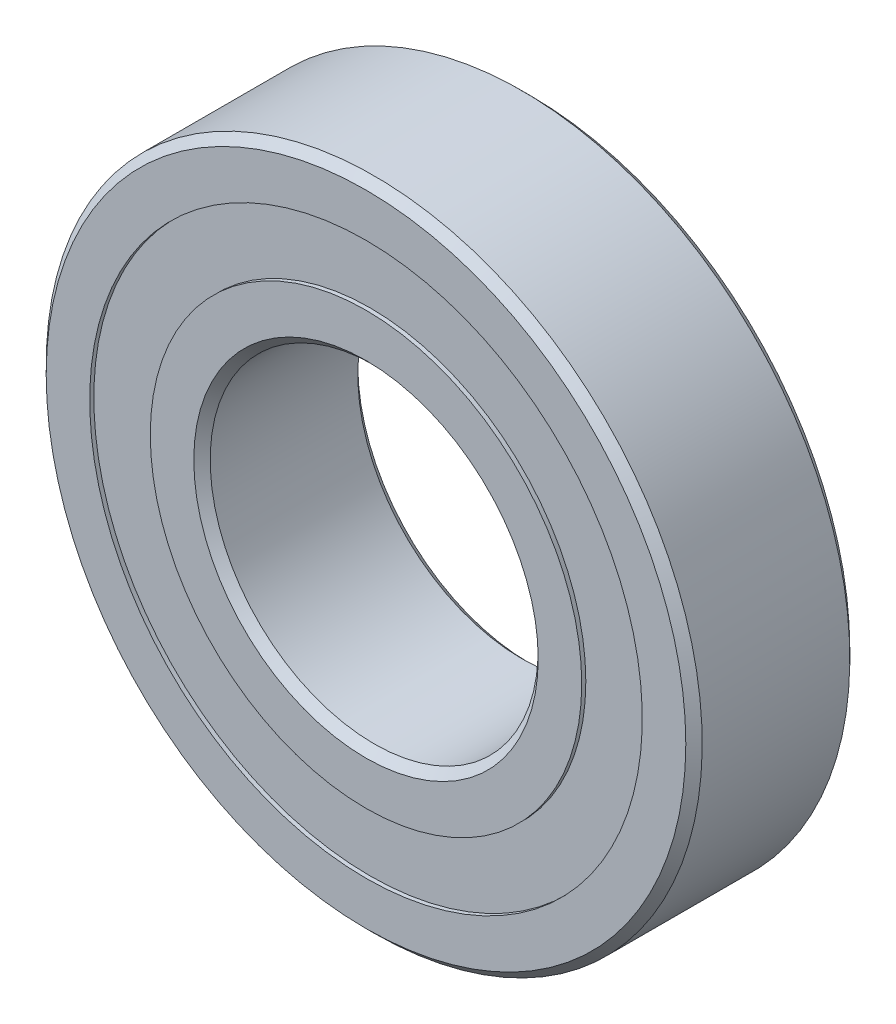
ISO-10303-21;
HEADER;
FILE_DESCRIPTION(('STEP AP214'),'2;1');
FILE_NAME('part.step','',(''),(''),'','','');
FILE_SCHEMA(('AUTOMOTIVE_DESIGN { 1 0 10303 214 1 1 1 1 }'));
ENDSEC;
DATA;
#1=APPLICATION_CONTEXT('core data for automotive mechanical design processes');
#2=APPLICATION_PROTOCOL_DEFINITION('international standard','automotive_design',2000,#1);
#3=PRODUCT_CONTEXT('',#1,'mechanical');
#4=PRODUCT('Part','Part','',(#3));
#5=PRODUCT_RELATED_PRODUCT_CATEGORY('part','',(#4));
#6=PRODUCT_DEFINITION_FORMATION('','',#4);
#7=PRODUCT_DEFINITION_CONTEXT('part definition',#1,'design');
#8=PRODUCT_DEFINITION('design','',#6,#7);
#9=PRODUCT_DEFINITION_SHAPE('','',#8);
#10=(LENGTH_UNIT() NAMED_UNIT(*) SI_UNIT(.MILLI.,.METRE.));
#11=(NAMED_UNIT(*) PLANE_ANGLE_UNIT() SI_UNIT($,.RADIAN.));
#12=(NAMED_UNIT(*) SI_UNIT($,.STERADIAN.) SOLID_ANGLE_UNIT());
#13=UNCERTAINTY_MEASURE_WITH_UNIT(LENGTH_MEASURE(1.E-05),#10,'distance_accuracy_value','');
#14=(GEOMETRIC_REPRESENTATION_CONTEXT(3) GLOBAL_UNCERTAINTY_ASSIGNED_CONTEXT((#13)) GLOBAL_UNIT_ASSIGNED_CONTEXT((#10,
#11,#12)) REPRESENTATION_CONTEXT('',''));
#15=CARTESIAN_POINT('',(0.,0.,0.));
#16=DIRECTION('',(0.,0.,1.));
#17=DIRECTION('',(1.,0.,0.));
#18=AXIS2_PLACEMENT_3D('',#15,#16,#17);
#19=CARTESIAN_POINT('',(0.,21.3946153846154,-6.0325));
#20=DIRECTION('',(0.,0.,1.));
#21=DIRECTION('',(0.,-1.,0.));
#22=AXIS2_PLACEMENT_3D('',#19,#20,#21);
#23=PLANE('',#22);
#24=CARTESIAN_POINT('',(0.,0.,-6.03250000000001));
#25=DIRECTION('',(0.,0.,1.));
#26=DIRECTION('',(0.,-1.,0.));
#27=AXIS2_PLACEMENT_3D('',#24,#25,#26);
#28=CIRCLE('',#27,21.3946153846154);
#29=CARTESIAN_POINT('',(0.,-21.3946153846154,-6.03250000000001));
#30=VERTEX_POINT('',#29);
#31=EDGE_CURVE('E68',#30,#30,#28,.T.);
#32=ORIENTED_EDGE('',*,*,#31,.F.);
#33=EDGE_LOOP('',(#32));
#34=FACE_BOUND('',#33,.T.);
#35=CARTESIAN_POINT('',(0.,0.,-6.03250000000001));
#36=DIRECTION('',(0.,0.,1.));
#37=DIRECTION('',(0.,-1.,0.));
#38=AXIS2_PLACEMENT_3D('',#35,#36,#37);
#39=CIRCLE('',#38,16.7053846153846);
#40=CARTESIAN_POINT('',(0.,-16.7053846153846,-6.03250000000001));
#41=VERTEX_POINT('',#40);
#42=EDGE_CURVE('E11',#41,#41,#39,.T.);
#43=ORIENTED_EDGE('',*,*,#42,.T.);
#44=EDGE_LOOP('',(#43));
#45=FACE_BOUND('',#44,.T.);
#46=ADVANCED_FACE('F50',(#34,#45),#23,.F.);
#47=CARTESIAN_POINT('',(0.,0.,6.35));
#48=DIRECTION('',(0.,0.,1.));
#49=DIRECTION('',(0.,-1.,0.));
#50=AXIS2_PLACEMENT_3D('',#47,#48,#49);
#51=CYLINDRICAL_SURFACE('',#50,16.7053846153846);
#52=ORIENTED_EDGE('',*,*,#42,.F.);
#53=EDGE_LOOP('',(#52));
#54=FACE_BOUND('',#53,.T.);
#55=CARTESIAN_POINT('',(0.,0.,-3.6690815708267));
#56=DIRECTION('',(0.,0.,1.));
#57=DIRECTION('',(0.,-1.,0.));
#58=AXIS2_PLACEMENT_3D('',#55,#56,#57);
#59=CIRCLE('',#58,16.7053846153846);
#60=CARTESIAN_POINT('',(0.,-16.7053846153846,-3.6690815708267));
#61=VERTEX_POINT('',#60);
#62=EDGE_CURVE('E57',#61,#61,#59,.T.);
#63=ORIENTED_EDGE('',*,*,#62,.T.);
#64=EDGE_LOOP('',(#63));
#65=FACE_BOUND('',#64,.T.);
#66=ADVANCED_FACE('F77',(#54,#65),#51,.F.);
#67=CARTESIAN_POINT('',(0.,21.3946153846154,-3.66908157082669));
#68=DIRECTION('',(0.,0.,-1.));
#69=DIRECTION('',(0.,1.,0.));
#70=AXIS2_PLACEMENT_3D('',#67,#68,#69);
#71=PLANE('',#70);
#72=ORIENTED_EDGE('',*,*,#62,.F.);
#73=EDGE_LOOP('',(#72));
#74=FACE_BOUND('',#73,.T.);
#75=CARTESIAN_POINT('',(0.,0.,-3.6690815708267));
#76=DIRECTION('',(0.,0.,1.));
#77=DIRECTION('',(0.,-1.,0.));
#78=AXIS2_PLACEMENT_3D('',#75,#76,#77);
#79=CIRCLE('',#78,21.3946153846154);
#80=CARTESIAN_POINT('',(0.,-21.3946153846154,-3.6690815708267));
#81=VERTEX_POINT('',#80);
#82=EDGE_CURVE('E63',#81,#81,#79,.T.);
#83=ORIENTED_EDGE('',*,*,#82,.T.);
#84=EDGE_LOOP('',(#83));
#85=FACE_BOUND('',#84,.T.);
#86=ADVANCED_FACE('F81',(#74,#85),#71,.F.);
#87=CARTESIAN_POINT('',(0.,0.,6.35));
#88=DIRECTION('',(0.,0.,1.));
#89=DIRECTION('',(0.,-1.,0.));
#90=AXIS2_PLACEMENT_3D('',#87,#88,#89);
#91=CYLINDRICAL_SURFACE('',#90,21.3946153846154);
#92=ORIENTED_EDGE('',*,*,#82,.F.);
#93=EDGE_LOOP('',(#92));
#94=FACE_BOUND('',#93,.T.);
#95=ORIENTED_EDGE('',*,*,#31,.T.);
#96=EDGE_LOOP('',(#95));
#97=FACE_BOUND('',#96,.T.);
#98=ADVANCED_FACE('F74',(#94,#97),#91,.T.);
#99=CLOSED_SHELL('',(#46,#66,#86,#98));
#100=MANIFOLD_SOLID_BREP('B2',#99);
#101=CARTESIAN_POINT('',(0.,21.3946153846154,6.0325));
#102=DIRECTION('',(0.,0.,-1.));
#103=DIRECTION('',(0.,1.,0.));
#104=AXIS2_PLACEMENT_3D('',#101,#102,#103);
#105=PLANE('',#104);
#106=CARTESIAN_POINT('',(0.,0.,6.0325));
#107=DIRECTION('',(0.,0.,1.));
#108=DIRECTION('',(0.,-1.,0.));
#109=AXIS2_PLACEMENT_3D('',#106,#107,#108);
#110=CIRCLE('',#109,16.7053846153846);
#111=CARTESIAN_POINT('',(0.,-16.7053846153846,6.03249999999999));
#112=VERTEX_POINT('',#111);
#113=EDGE_CURVE('E49',#112,#112,#110,.T.);
#114=ORIENTED_EDGE('',*,*,#113,.F.);
#115=EDGE_LOOP('',(#114));
#116=FACE_BOUND('',#115,.T.);
#117=CARTESIAN_POINT('',(0.,0.,6.0325));
#118=DIRECTION('',(0.,0.,1.));
#119=DIRECTION('',(0.,-1.,0.));
#120=AXIS2_PLACEMENT_3D('',#117,#118,#119);
#121=CIRCLE('',#120,21.3946153846154);
#122=CARTESIAN_POINT('',(0.,-21.3946153846154,6.03249999999999));
#123=VERTEX_POINT('',#122);
#124=EDGE_CURVE('E136',#123,#123,#121,.T.);
#125=ORIENTED_EDGE('',*,*,#124,.T.);
#126=EDGE_LOOP('',(#125));
#127=FACE_BOUND('',#126,.T.);
#128=ADVANCED_FACE('F118',(#116,#127),#105,.F.);
#129=CARTESIAN_POINT('',(0.,0.,6.35));
#130=DIRECTION('',(0.,0.,1.));
#131=DIRECTION('',(0.,-1.,0.));
#132=AXIS2_PLACEMENT_3D('',#129,#130,#131);
#133=CYLINDRICAL_SURFACE('',#132,16.7053846153846);
#134=CARTESIAN_POINT('',(0.,0.,3.66908157082669));
#135=DIRECTION('',(0.,0.,1.));
#136=DIRECTION('',(0.,-1.,0.));
#137=AXIS2_PLACEMENT_3D('',#134,#135,#136);
#138=CIRCLE('',#137,16.7053846153846);
#139=CARTESIAN_POINT('',(0.,-16.7053846153846,3.66908157082669));
#140=VERTEX_POINT('',#139);
#141=EDGE_CURVE('E125',#140,#140,#138,.T.);
#142=ORIENTED_EDGE('',*,*,#141,.F.);
#143=EDGE_LOOP('',(#142));
#144=FACE_BOUND('',#143,.T.);
#145=ORIENTED_EDGE('',*,*,#113,.T.);
#146=EDGE_LOOP('',(#145));
#147=FACE_BOUND('',#146,.T.);
#148=ADVANCED_FACE('F151',(#144,#147),#133,.F.);
#149=CARTESIAN_POINT('',(0.,21.3946153846154,3.66908157082669));
#150=DIRECTION('',(0.,0.,1.));
#151=DIRECTION('',(0.,-1.,0.));
#152=AXIS2_PLACEMENT_3D('',#149,#150,#151);
#153=PLANE('',#152);
#154=CARTESIAN_POINT('',(0.,0.,3.66908157082669));
#155=DIRECTION('',(0.,0.,1.));
#156=DIRECTION('',(0.,-1.,0.));
#157=AXIS2_PLACEMENT_3D('',#154,#155,#156);
#158=CIRCLE('',#157,21.3946153846154);
#159=CARTESIAN_POINT('',(0.,-21.3946153846154,3.66908157082669));
#160=VERTEX_POINT('',#159);
#161=EDGE_CURVE('E131',#160,#160,#158,.T.);
#162=ORIENTED_EDGE('',*,*,#161,.F.);
#163=EDGE_LOOP('',(#162));
#164=FACE_BOUND('',#163,.T.);
#165=ORIENTED_EDGE('',*,*,#141,.T.);
#166=EDGE_LOOP('',(#165));
#167=FACE_BOUND('',#166,.T.);
#168=ADVANCED_FACE('F146',(#164,#167),#153,.F.);
#169=CARTESIAN_POINT('',(0.,0.,6.35));
#170=DIRECTION('',(0.,0.,1.));
#171=DIRECTION('',(0.,-1.,0.));
#172=AXIS2_PLACEMENT_3D('',#169,#170,#171);
#173=CYLINDRICAL_SURFACE('',#172,21.3946153846154);
#174=ORIENTED_EDGE('',*,*,#124,.F.);
#175=EDGE_LOOP('',(#174));
#176=FACE_BOUND('',#175,.T.);
#177=ORIENTED_EDGE('',*,*,#161,.T.);
#178=EDGE_LOOP('',(#177));
#179=FACE_BOUND('',#178,.T.);
#180=ADVANCED_FACE('F143',(#176,#179),#173,.T.);
#181=CLOSED_SHELL('',(#128,#148,#168,#180));
#182=MANIFOLD_SOLID_BREP('B6',#181);
#183=CARTESIAN_POINT('',(-9.52499999999979,16.4977839420937,0.));
#184=DIRECTION('',(0.,0.,1.));
#185=DIRECTION('',(-0.499999999999989,0.866025403784445,0.));
#186=AXIS2_PLACEMENT_3D('',#183,#184,#185);
#187=SPHERICAL_SURFACE('',#186,3.66908157082669);
#188=CARTESIAN_POINT('',(-9.52499999999979,16.4977839420937,3.66908157082669));
#189=VERTEX_POINT('',#188);
#190=VERTEX_LOOP('',#189);
#191=FACE_BOUND('',#190,.T.);
#192=ADVANCED_FACE('F203',(#191),#187,.T.);
#193=CLOSED_SHELL('',(#192));
#194=MANIFOLD_SOLID_BREP('B44',#193);
#195=CARTESIAN_POINT('',(-16.4977839420934,9.52500000000019,0.));
#196=DIRECTION('',(0.,0.,1.));
#197=DIRECTION('',(-0.866025403784433,0.50000000000001,0.));
#198=AXIS2_PLACEMENT_3D('',#195,#196,#197);
#199=SPHERICAL_SURFACE('',#198,3.66908157082669);
#200=CARTESIAN_POINT('',(-16.4977839420934,9.52500000000019,3.66908157082669));
#201=VERTEX_POINT('',#200);
#202=VERTEX_LOOP('',#201);
#203=FACE_BOUND('',#202,.T.);
#204=ADVANCED_FACE('F220',(#203),#199,.T.);
#205=CLOSED_SHELL('',(#204));
#206=MANIFOLD_SOLID_BREP('B114',#205);
#207=CARTESIAN_POINT('',(-19.05,1.99538158514885E-13,0.));
#208=DIRECTION('',(0.,0.,1.));
#209=DIRECTION('',(-1.,0.,0.));
#210=AXIS2_PLACEMENT_3D('',#207,#208,#209);
#211=SPHERICAL_SURFACE('',#210,3.66908157082669);
#212=CARTESIAN_POINT('',(-19.05,1.98864159164657E-13,3.66908157082669));
#213=VERTEX_POINT('',#212);
#214=VERTEX_LOOP('',#213);
#215=FACE_BOUND('',#214,.T.);
#216=ADVANCED_FACE('F237',(#215),#211,.T.);
#217=CLOSED_SHELL('',(#216));
#218=MANIFOLD_SOLID_BREP('B199',#217);
#219=CARTESIAN_POINT('',(-16.4977839420936,-9.52499999999985,0.));
#220=DIRECTION('',(0.,0.,1.));
#221=DIRECTION('',(-0.866025403784443,-0.499999999999992,0.));
#222=AXIS2_PLACEMENT_3D('',#219,#220,#221);
#223=SPHERICAL_SURFACE('',#222,3.66908157082669);
#224=CARTESIAN_POINT('',(-16.4977839420936,-9.52499999999985,3.66908157082669));
#225=VERTEX_POINT('',#224);
#226=VERTEX_LOOP('',#225);
#227=FACE_BOUND('',#226,.T.);
#228=ADVANCED_FACE('F254',(#227),#223,.T.);
#229=CLOSED_SHELL('',(#228));
#230=MANIFOLD_SOLID_BREP('B216',#229);
#231=CARTESIAN_POINT('',(-9.52500000000013,-16.4977839420935,0.));
#232=DIRECTION('',(0.,0.,1.));
#233=DIRECTION('',(-0.500000000000007,-0.866025403784435,0.));
#234=AXIS2_PLACEMENT_3D('',#231,#232,#233);
#235=SPHERICAL_SURFACE('',#234,3.66908157082669);
#236=CARTESIAN_POINT('',(-9.52500000000013,-16.4977839420935,3.66908157082669));
#237=VERTEX_POINT('',#236);
#238=VERTEX_LOOP('',#237);
#239=FACE_BOUND('',#238,.T.);
#240=ADVANCED_FACE('F271',(#239),#235,.T.);
#241=CLOSED_SHELL('',(#240));
#242=MANIFOLD_SOLID_BREP('B233',#241);
#243=CARTESIAN_POINT('',(0.,-19.05,0.));
#244=DIRECTION('',(0.,0.,1.));
#245=DIRECTION('',(0.,-1.,0.));
#246=AXIS2_PLACEMENT_3D('',#243,#244,#245);
#247=SPHERICAL_SURFACE('',#246,3.66908157082669);
#248=CARTESIAN_POINT('',(0.,-19.05,3.66908157082669));
#249=VERTEX_POINT('',#248);
#250=VERTEX_LOOP('',#249);
#251=FACE_BOUND('',#250,.T.);
#252=ADVANCED_FACE('F288',(#251),#247,.T.);
#253=CLOSED_SHELL('',(#252));
#254=MANIFOLD_SOLID_BREP('B250',#253);
#255=CARTESIAN_POINT('',(9.5249999999999,-16.4977839420936,0.));
#256=DIRECTION('',(0.,0.,1.));
#257=DIRECTION('',(0.499999999999995,-0.866025403784442,0.));
#258=AXIS2_PLACEMENT_3D('',#255,#256,#257);
#259=SPHERICAL_SURFACE('',#258,3.66908157082669);
#260=CARTESIAN_POINT('',(9.5249999999999,-16.4977839420936,3.66908157082669));
#261=VERTEX_POINT('',#260);
#262=VERTEX_LOOP('',#261);
#263=FACE_BOUND('',#262,.T.);
#264=ADVANCED_FACE('F305',(#263),#259,.T.);
#265=CLOSED_SHELL('',(#264));
#266=MANIFOLD_SOLID_BREP('B267',#265);
#267=CARTESIAN_POINT('',(16.4977839420935,-9.52500000000008,0.));
#268=DIRECTION('',(0.,0.,1.));
#269=DIRECTION('',(0.866025403784436,-0.500000000000004,0.));
#270=AXIS2_PLACEMENT_3D('',#267,#268,#269);
#271=SPHERICAL_SURFACE('',#270,3.66908157082669);
#272=CARTESIAN_POINT('',(16.4977839420935,-9.52500000000008,3.66908157082669));
#273=VERTEX_POINT('',#272);
#274=VERTEX_LOOP('',#273);
#275=FACE_BOUND('',#274,.T.);
#276=ADVANCED_FACE('F322',(#275),#271,.T.);
#277=CLOSED_SHELL('',(#276));
#278=MANIFOLD_SOLID_BREP('B284',#277);
#279=CARTESIAN_POINT('',(19.05,0.,0.));
#280=DIRECTION('',(0.,0.,1.));
#281=DIRECTION('',(1.,0.,0.));
#282=AXIS2_PLACEMENT_3D('',#279,#280,#281);
#283=SPHERICAL_SURFACE('',#282,3.66908157082669);
#284=CARTESIAN_POINT('',(19.05,0.,3.66908157082669));
#285=VERTEX_POINT('',#284);
#286=VERTEX_LOOP('',#285);
#287=FACE_BOUND('',#286,.T.);
#288=ADVANCED_FACE('F339',(#287),#283,.T.);
#289=CLOSED_SHELL('',(#288));
#290=MANIFOLD_SOLID_BREP('B301',#289);
#291=CARTESIAN_POINT('',(16.4977839420936,9.52499999999996,0.));
#292=DIRECTION('',(0.,0.,1.));
#293=DIRECTION('',(0.86602540378444,0.499999999999998,0.));
#294=AXIS2_PLACEMENT_3D('',#291,#292,#293);
#295=SPHERICAL_SURFACE('',#294,3.66908157082669);
#296=CARTESIAN_POINT('',(16.4977839420936,9.52499999999996,3.66908157082669));
#297=VERTEX_POINT('',#296);
#298=VERTEX_LOOP('',#297);
#299=FACE_BOUND('',#298,.T.);
#300=ADVANCED_FACE('F357',(#299),#295,.T.);
#301=CLOSED_SHELL('',(#300));
#302=MANIFOLD_SOLID_BREP('B318',#301);
#303=CARTESIAN_POINT('',(9.52500000000002,16.4977839420935,0.));
#304=DIRECTION('',(0.,0.,1.));
#305=DIRECTION('',(0.500000000000001,0.866025403784438,0.));
#306=AXIS2_PLACEMENT_3D('',#303,#304,#305);
#307=SPHERICAL_SURFACE('',#306,3.66908157082669);
#308=CARTESIAN_POINT('',(9.52500000000002,16.4977839420935,3.66908157082669));
#309=VERTEX_POINT('',#308);
#310=VERTEX_LOOP('',#309);
#311=FACE_BOUND('',#310,.T.);
#312=ADVANCED_FACE('F374',(#311),#307,.T.);
#313=CLOSED_SHELL('',(#312));
#314=MANIFOLD_SOLID_BREP('B335',#313);
#315=CARTESIAN_POINT('',(0.,19.05,0.));
#316=DIRECTION('',(0.,0.,1.));
#317=DIRECTION('',(0.,1.,0.));
#318=AXIS2_PLACEMENT_3D('',#315,#316,#317);
#319=SPHERICAL_SURFACE('',#318,3.66908157082669);
#320=CARTESIAN_POINT('',(0.,19.05,3.66908157082669));
#321=VERTEX_POINT('',#320);
#322=VERTEX_LOOP('',#321);
#323=FACE_BOUND('',#322,.T.);
#324=ADVANCED_FACE('F393',(#323),#319,.T.);
#325=CLOSED_SHELL('',(#324));
#326=MANIFOLD_SOLID_BREP('B353',#325);
#327=CARTESIAN_POINT('',(0.,13.335,6.35000000000001));
#328=DIRECTION('',(0.,0.,-1.));
#329=DIRECTION('',(0.,1.,0.));
#330=AXIS2_PLACEMENT_3D('',#327,#328,#329);
#331=PLANE('',#330);
#332=CARTESIAN_POINT('',(0.,0.,6.35000000000001));
#333=DIRECTION('',(0.,0.,1.));
#334=DIRECTION('',(0.,-1.,0.));
#335=AXIS2_PLACEMENT_3D('',#332,#333,#334);
#336=CIRCLE('',#335,13.335);
#337=CARTESIAN_POINT('',(0.,-13.335,6.35));
#338=VERTEX_POINT('',#337);
#339=EDGE_CURVE('E446',#338,#338,#336,.T.);
#340=ORIENTED_EDGE('',*,*,#339,.F.);
#341=EDGE_LOOP('',(#340));
#342=FACE_BOUND('',#341,.T.);
#343=CARTESIAN_POINT('',(0.,0.,6.35000000000001));
#344=DIRECTION('',(0.,0.,1.));
#345=DIRECTION('',(0.,-1.,0.));
#346=AXIS2_PLACEMENT_3D('',#343,#344,#345);
#347=CIRCLE('',#346,16.7053846153846);
#348=CARTESIAN_POINT('',(0.,-16.7053846153846,6.35));
#349=VERTEX_POINT('',#348);
#350=EDGE_CURVE('E392',#349,#349,#347,.T.);
#351=ORIENTED_EDGE('',*,*,#350,.T.);
#352=EDGE_LOOP('',(#351));
#353=FACE_BOUND('',#352,.T.);
#354=ADVANCED_FACE('F411',(#342,#353),#331,.F.);
#355=CARTESIAN_POINT('',(0.,0.,6.35));
#356=DIRECTION('',(0.,0.,1.));
#357=DIRECTION('',(0.,-1.,0.));
#358=AXIS2_PLACEMENT_3D('',#355,#356,#357);
#359=CYLINDRICAL_SURFACE('',#358,16.7053846153846);
#360=ORIENTED_EDGE('',*,*,#350,.F.);
#361=EDGE_LOOP('',(#360));
#362=FACE_BOUND('',#361,.T.);
#363=CARTESIAN_POINT('',(0.,0.,2.82222222222221));
#364=DIRECTION('',(0.,0.,1.));
#365=DIRECTION('',(0.,-1.,0.));
#366=AXIS2_PLACEMENT_3D('',#363,#364,#365);
#367=CIRCLE('',#366,16.7053846153846);
#368=CARTESIAN_POINT('',(0.,-16.7053846153846,2.82222222222221));
#369=VERTEX_POINT('',#368);
#370=EDGE_CURVE('E418',#369,#369,#367,.T.);
#371=ORIENTED_EDGE('',*,*,#370,.T.);
#372=EDGE_LOOP('',(#371));
#373=FACE_BOUND('',#372,.T.);
#374=ADVANCED_FACE('F454',(#362,#373),#359,.T.);
#375=CARTESIAN_POINT('',(0.,0.,0.));
#376=DIRECTION('',(0.,0.,1.));
#377=DIRECTION('',(0.,-1.,0.));
#378=AXIS2_PLACEMENT_3D('',#375,#376,#377);
#379=TOROIDAL_SURFACE('',#378,19.05,3.66908157082669);
#380=ORIENTED_EDGE('',*,*,#370,.F.);
#381=EDGE_LOOP('',(#380));
#382=FACE_BOUND('',#381,.T.);
#383=CARTESIAN_POINT('',(0.,0.,-2.82222222222222));
#384=DIRECTION('',(0.,0.,1.));
#385=DIRECTION('',(0.,-1.,0.));
#386=AXIS2_PLACEMENT_3D('',#383,#384,#385);
#387=CIRCLE('',#386,16.7053846153846);
#388=CARTESIAN_POINT('',(0.,-16.7053846153846,-2.82222222222222));
#389=VERTEX_POINT('',#388);
#390=EDGE_CURVE('E424',#389,#389,#387,.T.);
#391=ORIENTED_EDGE('',*,*,#390,.T.);
#392=EDGE_LOOP('',(#391));
#393=FACE_BOUND('',#392,.T.);
#394=ADVANCED_FACE('F458',(#382,#393),#379,.F.);
#395=CARTESIAN_POINT('',(0.,0.,6.35));
#396=DIRECTION('',(0.,0.,1.));
#397=DIRECTION('',(0.,-1.,0.));
#398=AXIS2_PLACEMENT_3D('',#395,#396,#397);
#399=CYLINDRICAL_SURFACE('',#398,16.7053846153846);
#400=ORIENTED_EDGE('',*,*,#390,.F.);
#401=EDGE_LOOP('',(#400));
#402=FACE_BOUND('',#401,.T.);
#403=CARTESIAN_POINT('',(0.,0.,-6.35000000000001));
#404=DIRECTION('',(0.,0.,1.));
#405=DIRECTION('',(0.,-1.,0.));
#406=AXIS2_PLACEMENT_3D('',#403,#404,#405);
#407=CIRCLE('',#406,16.7053846153846);
#408=CARTESIAN_POINT('',(0.,-16.7053846153846,-6.35000000000002));
#409=VERTEX_POINT('',#408);
#410=EDGE_CURVE('E429',#409,#409,#407,.T.);
#411=ORIENTED_EDGE('',*,*,#410,.T.);
#412=EDGE_LOOP('',(#411));
#413=FACE_BOUND('',#412,.T.);
#414=ADVANCED_FACE('F462',(#402,#413),#399,.T.);
#415=CARTESIAN_POINT('',(0.,13.335,-6.35000000000001));
#416=DIRECTION('',(0.,0.,1.));
#417=DIRECTION('',(0.,-1.,0.));
#418=AXIS2_PLACEMENT_3D('',#415,#416,#417);
#419=PLANE('',#418);
#420=ORIENTED_EDGE('',*,*,#410,.F.);
#421=EDGE_LOOP('',(#420));
#422=FACE_BOUND('',#421,.T.);
#423=CARTESIAN_POINT('',(0.,0.,-6.35000000000001));
#424=DIRECTION('',(0.,0.,1.));
#425=DIRECTION('',(0.,-1.,0.));
#426=AXIS2_PLACEMENT_3D('',#423,#424,#425);
#427=CIRCLE('',#426,13.335);
#428=CARTESIAN_POINT('',(0.,-13.335,-6.35000000000001));
#429=VERTEX_POINT('',#428);
#430=EDGE_CURVE('E435',#429,#429,#427,.T.);
#431=ORIENTED_EDGE('',*,*,#430,.T.);
#432=EDGE_LOOP('',(#431));
#433=FACE_BOUND('',#432,.T.);
#434=ADVANCED_FACE('F468',(#422,#433),#419,.F.);
#435=CARTESIAN_POINT('',(0.,0.,-5.715));
#436=DIRECTION('',(0.,0.,-1.));
#437=DIRECTION('',(0.,1.,0.));
#438=AXIS2_PLACEMENT_3D('',#435,#436,#437);
#439=CONICAL_SURFACE('',#438,12.7,0.785398163397429);
#440=ORIENTED_EDGE('',*,*,#430,.F.);
#441=EDGE_LOOP('',(#440));
#442=FACE_BOUND('',#441,.T.);
#443=CARTESIAN_POINT('',(0.,0.,-5.715));
#444=DIRECTION('',(0.,0.,1.));
#445=DIRECTION('',(0.,-1.,0.));
#446=AXIS2_PLACEMENT_3D('',#443,#444,#445);
#447=CIRCLE('',#446,12.7);
#448=CARTESIAN_POINT('',(0.,-12.7,-5.715));
#449=VERTEX_POINT('',#448);
#450=EDGE_CURVE('E439',#449,#449,#447,.T.);
#451=ORIENTED_EDGE('',*,*,#450,.T.);
#452=EDGE_LOOP('',(#451));
#453=FACE_BOUND('',#452,.T.);
#454=ADVANCED_FACE('F471',(#442,#453),#439,.F.);
#455=CARTESIAN_POINT('',(0.,0.,6.35));
#456=DIRECTION('',(0.,0.,1.));
#457=DIRECTION('',(0.,-1.,0.));
#458=AXIS2_PLACEMENT_3D('',#455,#456,#457);
#459=CYLINDRICAL_SURFACE('',#458,12.7);
#460=ORIENTED_EDGE('',*,*,#450,.F.);
#461=EDGE_LOOP('',(#460));
#462=FACE_BOUND('',#461,.T.);
#463=CARTESIAN_POINT('',(0.,0.,5.715));
#464=DIRECTION('',(0.,0.,1.));
#465=DIRECTION('',(0.,-1.,0.));
#466=AXIS2_PLACEMENT_3D('',#463,#464,#465);
#467=CIRCLE('',#466,12.7);
#468=CARTESIAN_POINT('',(0.,-12.7,5.715));
#469=VERTEX_POINT('',#468);
#470=EDGE_CURVE('E443',#469,#469,#467,.T.);
#471=ORIENTED_EDGE('',*,*,#470,.T.);
#472=EDGE_LOOP('',(#471));
#473=FACE_BOUND('',#472,.T.);
#474=ADVANCED_FACE('F475',(#462,#473),#459,.F.);
#475=CARTESIAN_POINT('',(0.,0.,6.35000000000001));
#476=DIRECTION('',(0.,0.,1.));
#477=DIRECTION('',(0.,-1.,0.));
#478=AXIS2_PLACEMENT_3D('',#475,#476,#477);
#479=CONICAL_SURFACE('',#478,13.335,0.78539816339743);
#480=ORIENTED_EDGE('',*,*,#470,.F.);
#481=EDGE_LOOP('',(#480));
#482=FACE_BOUND('',#481,.T.);
#483=ORIENTED_EDGE('',*,*,#339,.T.);
#484=EDGE_LOOP('',(#483));
#485=FACE_BOUND('',#484,.T.);
#486=ADVANCED_FACE('F451',(#482,#485),#479,.F.);
#487=CLOSED_SHELL('',(#354,#374,#394,#414,#434,#454,#474,#486));
#488=MANIFOLD_SOLID_BREP('B370',#487);
#489=CARTESIAN_POINT('',(0.,0.,6.35));
#490=DIRECTION('',(0.,0.,1.));
#491=DIRECTION('',(0.,-1.,0.));
#492=AXIS2_PLACEMENT_3D('',#489,#490,#491);
#493=CYLINDRICAL_SURFACE('',#492,25.4);
#494=CARTESIAN_POINT('',(0.,0.,5.715));
#495=DIRECTION('',(0.,0.,1.));
#496=DIRECTION('',(0.,-1.,0.));
#497=AXIS2_PLACEMENT_3D('',#494,#495,#496);
#498=CIRCLE('',#497,25.4);
#499=CARTESIAN_POINT('',(0.,-25.4,5.71499999999999));
#500=VERTEX_POINT('',#499);
#501=EDGE_CURVE('E410',#500,#500,#498,.T.);
#502=ORIENTED_EDGE('',*,*,#501,.F.);
#503=EDGE_LOOP('',(#502));
#504=FACE_BOUND('',#503,.T.);
#505=CARTESIAN_POINT('',(0.,0.,-5.71500000000001));
#506=DIRECTION('',(0.,0.,1.));
#507=DIRECTION('',(0.,-1.,0.));
#508=AXIS2_PLACEMENT_3D('',#505,#506,#507);
#509=CIRCLE('',#508,25.4);
#510=CARTESIAN_POINT('',(0.,-25.4,-5.71500000000001));
#511=VERTEX_POINT('',#510);
#512=EDGE_CURVE('E567',#511,#511,#509,.T.);
#513=ORIENTED_EDGE('',*,*,#512,.T.);
#514=EDGE_LOOP('',(#513));
#515=FACE_BOUND('',#514,.T.);
#516=ADVANCED_FACE('F532',(#504,#515),#493,.T.);
#517=CARTESIAN_POINT('',(0.,0.,5.715));
#518=DIRECTION('',(0.,0.,-1.));
#519=DIRECTION('',(0.,1.,0.));
#520=AXIS2_PLACEMENT_3D('',#517,#518,#519);
#521=CONICAL_SURFACE('',#520,25.4,0.785398163397446);
#522=CARTESIAN_POINT('',(0.,0.,6.35));
#523=DIRECTION('',(0.,0.,1.));
#524=DIRECTION('',(0.,-1.,0.));
#525=AXIS2_PLACEMENT_3D('',#522,#523,#524);
#526=CIRCLE('',#525,24.765);
#527=CARTESIAN_POINT('',(0.,-24.765,6.34999999999999));
#528=VERTEX_POINT('',#527);
#529=EDGE_CURVE('E539',#528,#528,#526,.T.);
#530=ORIENTED_EDGE('',*,*,#529,.F.);
#531=EDGE_LOOP('',(#530));
#532=FACE_BOUND('',#531,.T.);
#533=ORIENTED_EDGE('',*,*,#501,.T.);
#534=EDGE_LOOP('',(#533));
#535=FACE_BOUND('',#534,.T.);
#536=ADVANCED_FACE('F605',(#532,#535),#521,.T.);
#537=CARTESIAN_POINT('',(0.,24.765,6.35));
#538=DIRECTION('',(0.,0.,-1.));
#539=DIRECTION('',(0.,1.,0.));
#540=AXIS2_PLACEMENT_3D('',#537,#538,#539);
#541=PLANE('',#540);
#542=CARTESIAN_POINT('',(0.,0.,6.35));
#543=DIRECTION('',(0.,0.,1.));
#544=DIRECTION('',(0.,-1.,0.));
#545=AXIS2_PLACEMENT_3D('',#542,#543,#544);
#546=CIRCLE('',#545,21.3946153846154);
#547=CARTESIAN_POINT('',(0.,-21.3946153846154,6.34999999999999));
#548=VERTEX_POINT('',#547);
#549=EDGE_CURVE('E546',#548,#548,#546,.T.);
#550=ORIENTED_EDGE('',*,*,#549,.F.);
#551=EDGE_LOOP('',(#550));
#552=FACE_BOUND('',#551,.T.);
#553=ORIENTED_EDGE('',*,*,#529,.T.);
#554=EDGE_LOOP('',(#553));
#555=FACE_BOUND('',#554,.T.);
#556=ADVANCED_FACE('F600',(#552,#555),#541,.F.);
#557=CARTESIAN_POINT('',(0.,0.,6.35));
#558=DIRECTION('',(0.,0.,1.));
#559=DIRECTION('',(0.,-1.,0.));
#560=AXIS2_PLACEMENT_3D('',#557,#558,#559);
#561=CYLINDRICAL_SURFACE('',#560,21.3946153846154);
#562=CARTESIAN_POINT('',(0.,0.,2.82222222222222));
#563=DIRECTION('',(0.,0.,1.));
#564=DIRECTION('',(0.,-1.,0.));
#565=AXIS2_PLACEMENT_3D('',#562,#563,#564);
#566=CIRCLE('',#565,21.3946153846154);
#567=CARTESIAN_POINT('',(0.,-21.3946153846154,2.82222222222222));
#568=VERTEX_POINT('',#567);
#569=EDGE_CURVE('E551',#568,#568,#566,.T.);
#570=ORIENTED_EDGE('',*,*,#569,.F.);
#571=EDGE_LOOP('',(#570));
#572=FACE_BOUND('',#571,.T.);
#573=ORIENTED_EDGE('',*,*,#549,.T.);
#574=EDGE_LOOP('',(#573));
#575=FACE_BOUND('',#574,.T.);
#576=ADVANCED_FACE('F594',(#572,#575),#561,.F.);
#577=CARTESIAN_POINT('',(0.,0.,0.));
#578=DIRECTION('',(0.,0.,1.));
#579=DIRECTION('',(0.,-1.,0.));
#580=AXIS2_PLACEMENT_3D('',#577,#578,#579);
#581=TOROIDAL_SURFACE('',#580,19.05,3.66908157082669);
#582=CARTESIAN_POINT('',(0.,0.,-2.82222222222223));
#583=DIRECTION('',(0.,0.,1.));
#584=DIRECTION('',(0.,-1.,0.));
#585=AXIS2_PLACEMENT_3D('',#582,#583,#584);
#586=CIRCLE('',#585,21.3946153846154);
#587=CARTESIAN_POINT('',(0.,-21.3946153846154,-2.82222222222223));
#588=VERTEX_POINT('',#587);
#589=EDGE_CURVE('E556',#588,#588,#586,.T.);
#590=ORIENTED_EDGE('',*,*,#589,.F.);
#591=EDGE_LOOP('',(#590));
#592=FACE_BOUND('',#591,.T.);
#593=ORIENTED_EDGE('',*,*,#569,.T.);
#594=EDGE_LOOP('',(#593));
#595=FACE_BOUND('',#594,.T.);
#596=ADVANCED_FACE('F588',(#592,#595),#581,.F.);
#597=CARTESIAN_POINT('',(0.,0.,6.35));
#598=DIRECTION('',(0.,0.,1.));
#599=DIRECTION('',(0.,-1.,0.));
#600=AXIS2_PLACEMENT_3D('',#597,#598,#599);
#601=CYLINDRICAL_SURFACE('',#600,21.3946153846154);
#602=CARTESIAN_POINT('',(0.,0.,-6.35));
#603=DIRECTION('',(0.,0.,1.));
#604=DIRECTION('',(0.,-1.,0.));
#605=AXIS2_PLACEMENT_3D('',#602,#603,#604);
#606=CIRCLE('',#605,21.3946153846154);
#607=CARTESIAN_POINT('',(0.,-21.3946153846154,-6.35000000000001));
#608=VERTEX_POINT('',#607);
#609=EDGE_CURVE('E559',#608,#608,#606,.T.);
#610=ORIENTED_EDGE('',*,*,#609,.F.);
#611=EDGE_LOOP('',(#610));
#612=FACE_BOUND('',#611,.T.);
#613=ORIENTED_EDGE('',*,*,#589,.T.);
#614=EDGE_LOOP('',(#613));
#615=FACE_BOUND('',#614,.T.);
#616=ADVANCED_FACE('F582',(#612,#615),#601,.F.);
#617=CARTESIAN_POINT('',(0.,24.765,-6.35));
#618=DIRECTION('',(0.,0.,1.));
#619=DIRECTION('',(0.,-1.,0.));
#620=AXIS2_PLACEMENT_3D('',#617,#618,#619);
#621=PLANE('',#620);
#622=CARTESIAN_POINT('',(0.,0.,-6.35));
#623=DIRECTION('',(0.,0.,1.));
#624=DIRECTION('',(0.,-1.,0.));
#625=AXIS2_PLACEMENT_3D('',#622,#623,#624);
#626=CIRCLE('',#625,24.765);
#627=CARTESIAN_POINT('',(0.,-24.765,-6.35000000000001));
#628=VERTEX_POINT('',#627);
#629=EDGE_CURVE('E563',#628,#628,#626,.T.);
#630=ORIENTED_EDGE('',*,*,#629,.F.);
#631=EDGE_LOOP('',(#630));
#632=FACE_BOUND('',#631,.T.);
#633=ORIENTED_EDGE('',*,*,#609,.T.);
#634=EDGE_LOOP('',(#633));
#635=FACE_BOUND('',#634,.T.);
#636=ADVANCED_FACE('F576',(#632,#635),#621,.F.);
#637=CARTESIAN_POINT('',(0.,0.,-6.35));
#638=DIRECTION('',(0.,0.,1.));
#639=DIRECTION('',(0.,-1.,0.));
#640=AXIS2_PLACEMENT_3D('',#637,#638,#639);
#641=CONICAL_SURFACE('',#640,24.765,0.785398163397446);
#642=ORIENTED_EDGE('',*,*,#512,.F.);
#643=EDGE_LOOP('',(#642));
#644=FACE_BOUND('',#643,.T.);
#645=ORIENTED_EDGE('',*,*,#629,.T.);
#646=EDGE_LOOP('',(#645));
#647=FACE_BOUND('',#646,.T.);
#648=ADVANCED_FACE('F573',(#644,#647),#641,.T.);
#649=CLOSED_SHELL('',(#516,#536,#556,#576,#596,#616,#636,#648));
#650=MANIFOLD_SOLID_BREP('B387',#649);
#651=ADVANCED_BREP_SHAPE_REPRESENTATION('',(#18,#100,#182,#194,#206,#218,#230,#242,#254,#266,
#278,#290,#302,#314,#326,#488,#650),#14);
#652=SHAPE_DEFINITION_REPRESENTATION(#9,#651);
ENDSEC;
END-ISO-10303-21;
